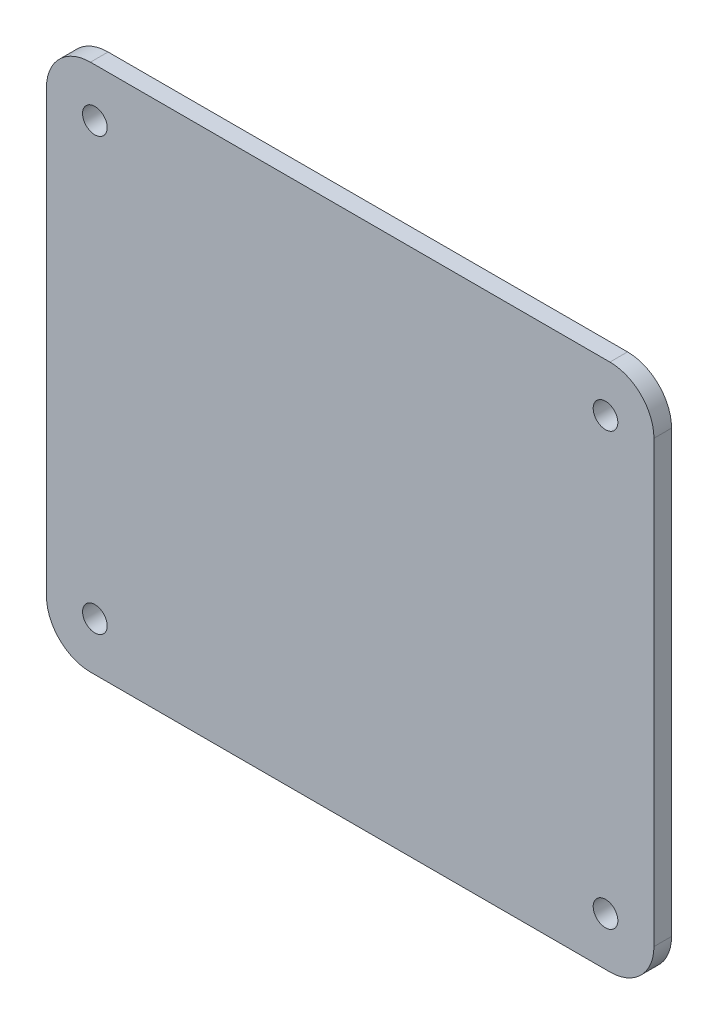
ISO-10303-21;
HEADER;
FILE_DESCRIPTION(('STEP AP214'),'2;1');
FILE_NAME('part.step','',(''),(''),'','','');
FILE_SCHEMA(('AUTOMOTIVE_DESIGN { 1 0 10303 214 1 1 1 1 }'));
ENDSEC;
DATA;
#1=APPLICATION_CONTEXT('core data for automotive mechanical design processes');
#2=APPLICATION_PROTOCOL_DEFINITION('international standard','automotive_design',2000,#1);
#3=PRODUCT_CONTEXT('',#1,'mechanical');
#4=PRODUCT('Part','Part','',(#3));
#5=PRODUCT_RELATED_PRODUCT_CATEGORY('part','',(#4));
#6=PRODUCT_DEFINITION_FORMATION('','',#4);
#7=PRODUCT_DEFINITION_CONTEXT('part definition',#1,'design');
#8=PRODUCT_DEFINITION('design','',#6,#7);
#9=PRODUCT_DEFINITION_SHAPE('','',#8);
#10=(LENGTH_UNIT() NAMED_UNIT(*) SI_UNIT(.MILLI.,.METRE.));
#11=(NAMED_UNIT(*) PLANE_ANGLE_UNIT() SI_UNIT($,.RADIAN.));
#12=(NAMED_UNIT(*) SI_UNIT($,.STERADIAN.) SOLID_ANGLE_UNIT());
#13=UNCERTAINTY_MEASURE_WITH_UNIT(LENGTH_MEASURE(1.E-05),#10,'distance_accuracy_value','');
#14=(GEOMETRIC_REPRESENTATION_CONTEXT(3) GLOBAL_UNCERTAINTY_ASSIGNED_CONTEXT((#13)) GLOBAL_UNIT_ASSIGNED_CONTEXT((#10,
#11,#12)) REPRESENTATION_CONTEXT('',''));
#15=CARTESIAN_POINT('',(0.,0.,0.));
#16=DIRECTION('',(0.,0.,1.));
#17=DIRECTION('',(1.,0.,0.));
#18=AXIS2_PLACEMENT_3D('',#15,#16,#17);
#19=CARTESIAN_POINT('',(-18.2728243166483,9.35780803146775,53.7908655605488));
#20=DIRECTION('',(0.,0.,1.));
#21=DIRECTION('',(1.,0.,0.));
#22=AXIS2_PLACEMENT_3D('',#19,#20,#21);
#23=PLANE('',#22);
#24=DIRECTION('',(0.,-1.,0.));
#25=VECTOR('',#24,1.);
#26=CARTESIAN_POINT('',(-8.27282431664827,54.3578080314676,53.7908655605488));
#27=LINE('',#26,#25);
#28=CARTESIAN_POINT('',(-8.27282431664827,54.3578080314676,53.7908655605488));
#29=VERTEX_POINT('',#28);
#30=CARTESIAN_POINT('',(-8.27282431664827,49.3578080314676,53.7908655605488));
#31=VERTEX_POINT('',#30);
#32=EDGE_CURVE('E275',#29,#31,#27,.T.);
#33=ORIENTED_EDGE('',*,*,#32,.F.);
#34=DIRECTION('',(1.,0.,0.));
#35=VECTOR('',#34,1.);
#36=CARTESIAN_POINT('',(-8.27282431664827,54.3578080314676,53.7908655605488));
#37=LINE('',#36,#35);
#38=CARTESIAN_POINT('',(-13.2728243166483,54.3578080314676,53.7908655605488));
#39=VERTEX_POINT('',#38);
#40=EDGE_CURVE('E280',#39,#29,#37,.T.);
#41=ORIENTED_EDGE('',*,*,#40,.F.);
#42=DIRECTION('',(0.,1.,0.));
#43=VECTOR('',#42,1.);
#44=CARTESIAN_POINT('',(-13.2728243166483,54.3578080314676,53.7908655605488));
#45=LINE('',#44,#43);
#46=CARTESIAN_POINT('',(-13.2728243166483,49.3578080314676,53.7908655605488));
#47=VERTEX_POINT('',#46);
#48=EDGE_CURVE('E292',#47,#39,#45,.T.);
#49=ORIENTED_EDGE('',*,*,#48,.F.);
#50=DIRECTION('',(-1.,0.,0.));
#51=VECTOR('',#50,1.);
#52=CARTESIAN_POINT('',(-8.27282431664827,49.3578080314676,53.7908655605488));
#53=LINE('',#52,#51);
#54=EDGE_CURVE('E289',#31,#47,#53,.T.);
#55=ORIENTED_EDGE('',*,*,#54,.F.);
#56=EDGE_LOOP('',(#33,#41,#49,#55));
#57=FACE_BOUND('',#56,.T.);
#58=DIRECTION('',(0.,-1.,0.));
#59=VECTOR('',#58,1.);
#60=CARTESIAN_POINT('',(35.7271756833516,54.3578080314676,53.7908655605488));
#61=LINE('',#60,#59);
#62=CARTESIAN_POINT('',(35.7271756833516,54.3578080314676,53.7908655605488));
#63=VERTEX_POINT('',#62);
#64=CARTESIAN_POINT('',(35.7271756833516,49.3578080314676,53.7908655605488));
#65=VERTEX_POINT('',#64);
#66=EDGE_CURVE('E341',#63,#65,#61,.T.);
#67=ORIENTED_EDGE('',*,*,#66,.F.);
#68=DIRECTION('',(1.,0.,0.));
#69=VECTOR('',#68,1.);
#70=CARTESIAN_POINT('',(35.7271756833516,54.3578080314676,53.7908655605488));
#71=LINE('',#70,#69);
#72=CARTESIAN_POINT('',(30.7271756833516,54.3578080314676,53.7908655605488));
#73=VERTEX_POINT('',#72);
#74=EDGE_CURVE('E346',#73,#63,#71,.T.);
#75=ORIENTED_EDGE('',*,*,#74,.F.);
#76=DIRECTION('',(0.,1.,0.));
#77=VECTOR('',#76,1.);
#78=CARTESIAN_POINT('',(30.7271756833516,54.3578080314676,53.7908655605488));
#79=LINE('',#78,#77);
#80=CARTESIAN_POINT('',(30.7271756833516,49.3578080314676,53.7908655605488));
#81=VERTEX_POINT('',#80);
#82=EDGE_CURVE('E358',#81,#73,#79,.T.);
#83=ORIENTED_EDGE('',*,*,#82,.F.);
#84=DIRECTION('',(-1.,0.,0.));
#85=VECTOR('',#84,1.);
#86=CARTESIAN_POINT('',(35.7271756833516,49.3578080314676,53.7908655605488));
#87=LINE('',#86,#85);
#88=EDGE_CURVE('E355',#65,#81,#87,.T.);
#89=ORIENTED_EDGE('',*,*,#88,.F.);
#90=EDGE_LOOP('',(#67,#75,#83,#89));
#91=FACE_BOUND('',#90,.T.);
#92=CARTESIAN_POINT('',(40.2271756833516,58.8578080314677,53.7908655605488));
#93=DIRECTION('',(0.,0.,1.));
#94=DIRECTION('',(-1.,0.,0.));
#95=AXIS2_PLACEMENT_3D('',#92,#93,#94);
#96=CIRCLE('',#95,1.39999999999984);
#97=CARTESIAN_POINT('',(38.8271756833518,58.8578080314677,53.7908655605488));
#98=VERTEX_POINT('',#97);
#99=EDGE_CURVE('E374',#98,#98,#96,.T.);
#100=ORIENTED_EDGE('',*,*,#99,.T.);
#101=EDGE_LOOP('',(#100));
#102=FACE_BOUND('',#101,.T.);
#103=CARTESIAN_POINT('',(-17.7728243166482,58.8578080314677,53.7908655605488));
#104=DIRECTION('',(0.,0.,1.));
#105=DIRECTION('',(1.,0.,0.));
#106=AXIS2_PLACEMENT_3D('',#103,#104,#105);
#107=CIRCLE('',#106,1.39999999999984);
#108=CARTESIAN_POINT('',(-16.3728243166483,58.8578080314677,53.7908655605488));
#109=VERTEX_POINT('',#108);
#110=EDGE_CURVE('E379',#109,#109,#107,.T.);
#111=ORIENTED_EDGE('',*,*,#110,.T.);
#112=EDGE_LOOP('',(#111));
#113=FACE_BOUND('',#112,.T.);
#114=CARTESIAN_POINT('',(-17.7728243166482,9.85780803146746,53.7908655605488));
#115=DIRECTION('',(0.,0.,1.));
#116=DIRECTION('',(-1.,0.,0.));
#117=AXIS2_PLACEMENT_3D('',#114,#115,#116);
#118=CIRCLE('',#117,1.39999999999984);
#119=CARTESIAN_POINT('',(-19.172824316648,9.85780803146746,53.7908655605488));
#120=VERTEX_POINT('',#119);
#121=EDGE_CURVE('E375',#120,#120,#118,.T.);
#122=ORIENTED_EDGE('',*,*,#121,.T.);
#123=EDGE_LOOP('',(#122));
#124=FACE_BOUND('',#123,.T.);
#125=CARTESIAN_POINT('',(40.2271756833516,9.85780803146746,53.7908655605488));
#126=DIRECTION('',(0.,0.,1.));
#127=DIRECTION('',(1.,0.,0.));
#128=AXIS2_PLACEMENT_3D('',#125,#126,#127);
#129=CIRCLE('',#128,1.39999999999984);
#130=CARTESIAN_POINT('',(41.6271756833515,9.85780803146746,53.7908655605488));
#131=VERTEX_POINT('',#130);
#132=EDGE_CURVE('E378',#131,#131,#129,.T.);
#133=ORIENTED_EDGE('',*,*,#132,.T.);
#134=EDGE_LOOP('',(#133));
#135=FACE_BOUND('',#134,.T.);
#136=CARTESIAN_POINT('',(-18.2728243166483,9.35780803146775,53.7908655605488));
#137=DIRECTION('',(0.,0.,1.));
#138=DIRECTION('',(1.,0.,0.));
#139=AXIS2_PLACEMENT_3D('',#136,#137,#138);
#140=CIRCLE('',#139,5.);
#141=CARTESIAN_POINT('',(-23.2728243166483,9.35780803146777,53.7908655605488));
#142=VERTEX_POINT('',#141);
#143=CARTESIAN_POINT('',(-18.2728243166483,4.35780803146775,53.7908655605488));
#144=VERTEX_POINT('',#143);
#145=EDGE_CURVE('E386',#142,#144,#140,.T.);
#146=ORIENTED_EDGE('',*,*,#145,.F.);
#147=DIRECTION('',(0.,-1.,0.));
#148=VECTOR('',#147,1.);
#149=CARTESIAN_POINT('',(-23.2728243166483,59.3578080314677,53.7908655605488));
#150=LINE('',#149,#148);
#151=CARTESIAN_POINT('',(-23.2728243166483,59.3578080314677,53.7908655605488));
#152=VERTEX_POINT('',#151);
#153=EDGE_CURVE('E206',#152,#142,#150,.T.);
#154=ORIENTED_EDGE('',*,*,#153,.F.);
#155=CARTESIAN_POINT('',(-18.2728243166483,59.3578080314678,53.7908655605488));
#156=DIRECTION('',(0.,0.,1.));
#157=DIRECTION('',(1.,0.,0.));
#158=AXIS2_PLACEMENT_3D('',#155,#156,#157);
#159=CIRCLE('',#158,4.99999999999999);
#160=CARTESIAN_POINT('',(-18.2728243166483,64.3578080314677,53.7908655605488));
#161=VERTEX_POINT('',#160);
#162=EDGE_CURVE('E402',#161,#152,#159,.T.);
#163=ORIENTED_EDGE('',*,*,#162,.F.);
#164=DIRECTION('',(-1.,0.,0.));
#165=VECTOR('',#164,1.);
#166=CARTESIAN_POINT('',(40.7271756833517,64.3578080314676,53.7908655605488));
#167=LINE('',#166,#165);
#168=CARTESIAN_POINT('',(40.7271756833517,64.3578080314676,53.7908655605488));
#169=VERTEX_POINT('',#168);
#170=EDGE_CURVE('E201',#169,#161,#167,.T.);
#171=ORIENTED_EDGE('',*,*,#170,.F.);
#172=CARTESIAN_POINT('',(40.7271756833517,59.3578080314676,53.7908655605488));
#173=DIRECTION('',(0.,0.,1.));
#174=DIRECTION('',(1.,0.,0.));
#175=AXIS2_PLACEMENT_3D('',#172,#173,#174);
#176=CIRCLE('',#175,5.00000000000002);
#177=CARTESIAN_POINT('',(45.7271756833517,59.3578080314676,53.7908655605488));
#178=VERTEX_POINT('',#177);
#179=EDGE_CURVE('E398',#178,#169,#176,.T.);
#180=ORIENTED_EDGE('',*,*,#179,.F.);
#181=DIRECTION('',(0.,1.,0.));
#182=VECTOR('',#181,1.);
#183=CARTESIAN_POINT('',(45.7271756833516,9.35780803146761,53.7908655605488));
#184=LINE('',#183,#182);
#185=CARTESIAN_POINT('',(45.7271756833516,9.35780803146761,53.7908655605488));
#186=VERTEX_POINT('',#185);
#187=EDGE_CURVE('E395',#186,#178,#184,.T.);
#188=ORIENTED_EDGE('',*,*,#187,.F.);
#189=CARTESIAN_POINT('',(40.7271756833517,9.35780803146761,53.7908655605488));
#190=DIRECTION('',(0.,0.,1.));
#191=DIRECTION('',(1.,0.,0.));
#192=AXIS2_PLACEMENT_3D('',#189,#190,#191);
#193=CIRCLE('',#192,4.99999999999987);
#194=CARTESIAN_POINT('',(40.7271756833517,4.35780803146774,53.7908655605488));
#195=VERTEX_POINT('',#194);
#196=EDGE_CURVE('E392',#195,#186,#193,.T.);
#197=ORIENTED_EDGE('',*,*,#196,.F.);
#198=DIRECTION('',(1.,0.,0.));
#199=VECTOR('',#198,1.);
#200=CARTESIAN_POINT('',(-18.2728243166483,4.35780803146775,53.7908655605488));
#201=LINE('',#200,#199);
#202=EDGE_CURVE('E389',#144,#195,#201,.T.);
#203=ORIENTED_EDGE('',*,*,#202,.F.);
#204=EDGE_LOOP('',(#146,#154,#163,#171,#180,#188,#197,#203));
#205=FACE_BOUND('',#204,.T.);
#206=DIRECTION('',(0.,-1.,0.));
#207=VECTOR('',#206,1.);
#208=CARTESIAN_POINT('',(-8.27282431664828,19.3578080314677,53.7908655605488));
#209=LINE('',#208,#207);
#210=CARTESIAN_POINT('',(-8.27282431664828,19.3578080314677,53.7908655605488));
#211=VERTEX_POINT('',#210);
#212=CARTESIAN_POINT('',(-8.27282431664828,14.3578080314677,53.7908655605488));
#213=VERTEX_POINT('',#212);
#214=EDGE_CURVE('E308',#211,#213,#209,.T.);
#215=ORIENTED_EDGE('',*,*,#214,.F.);
#216=DIRECTION('',(1.,0.,0.));
#217=VECTOR('',#216,1.);
#218=CARTESIAN_POINT('',(-8.27282431664828,19.3578080314677,53.7908655605488));
#219=LINE('',#218,#217);
#220=CARTESIAN_POINT('',(-13.2728243166483,19.3578080314677,53.7908655605488));
#221=VERTEX_POINT('',#220);
#222=EDGE_CURVE('E313',#221,#211,#219,.T.);
#223=ORIENTED_EDGE('',*,*,#222,.F.);
#224=DIRECTION('',(0.,1.,0.));
#225=VECTOR('',#224,1.);
#226=CARTESIAN_POINT('',(-13.2728243166483,19.3578080314677,53.7908655605488));
#227=LINE('',#226,#225);
#228=CARTESIAN_POINT('',(-13.2728243166483,14.3578080314677,53.7908655605488));
#229=VERTEX_POINT('',#228);
#230=EDGE_CURVE('E325',#229,#221,#227,.T.);
#231=ORIENTED_EDGE('',*,*,#230,.F.);
#232=DIRECTION('',(-1.,0.,0.));
#233=VECTOR('',#232,1.);
#234=CARTESIAN_POINT('',(-8.27282431664828,14.3578080314677,53.7908655605488));
#235=LINE('',#234,#233);
#236=EDGE_CURVE('E322',#213,#229,#235,.T.);
#237=ORIENTED_EDGE('',*,*,#236,.F.);
#238=EDGE_LOOP('',(#215,#223,#231,#237));
#239=FACE_BOUND('',#238,.T.);
#240=DIRECTION('',(0.,-1.,0.));
#241=VECTOR('',#240,1.);
#242=CARTESIAN_POINT('',(35.7271756833516,19.3578080314677,53.7908655605488));
#243=LINE('',#242,#241);
#244=CARTESIAN_POINT('',(35.7271756833516,19.3578080314677,53.7908655605488));
#245=VERTEX_POINT('',#244);
#246=CARTESIAN_POINT('',(35.7271756833516,14.3578080314677,53.7908655605488));
#247=VERTEX_POINT('',#246);
#248=EDGE_CURVE('E247',#245,#247,#243,.T.);
#249=ORIENTED_EDGE('',*,*,#248,.F.);
#250=DIRECTION('',(1.,0.,0.));
#251=VECTOR('',#250,1.);
#252=CARTESIAN_POINT('',(35.7271756833516,19.3578080314677,53.7908655605488));
#253=LINE('',#252,#251);
#254=CARTESIAN_POINT('',(30.7271756833516,19.3578080314677,53.7908655605488));
#255=VERTEX_POINT('',#254);
#256=EDGE_CURVE('E252',#255,#245,#253,.T.);
#257=ORIENTED_EDGE('',*,*,#256,.F.);
#258=DIRECTION('',(0.,1.,0.));
#259=VECTOR('',#258,1.);
#260=CARTESIAN_POINT('',(30.7271756833516,19.3578080314677,53.7908655605488));
#261=LINE('',#260,#259);
#262=CARTESIAN_POINT('',(30.7271756833516,14.3578080314677,53.7908655605488));
#263=VERTEX_POINT('',#262);
#264=EDGE_CURVE('E57',#263,#255,#261,.T.);
#265=ORIENTED_EDGE('',*,*,#264,.F.);
#266=DIRECTION('',(-1.,0.,0.));
#267=VECTOR('',#266,1.);
#268=CARTESIAN_POINT('',(35.7271756833516,14.3578080314677,53.7908655605488));
#269=LINE('',#268,#267);
#270=EDGE_CURVE('E52',#247,#263,#269,.T.);
#271=ORIENTED_EDGE('',*,*,#270,.F.);
#272=EDGE_LOOP('',(#249,#257,#265,#271));
#273=FACE_BOUND('',#272,.T.);
#274=ADVANCED_FACE('F37',(#57,#91,#102,#113,#124,#135,#205,#239,#273),#23,.F.);
#275=CARTESIAN_POINT('',(-18.2728243166483,59.3578080314678,61.7908655605488));
#276=DIRECTION('',(0.,0.,-1.));
#277=DIRECTION('',(-1.,0.,0.));
#278=AXIS2_PLACEMENT_3D('',#275,#276,#277);
#279=CYLINDRICAL_SURFACE('',#278,4.99999999999999);
#280=DIRECTION('',(0.,0.,-1.));
#281=VECTOR('',#280,1.);
#282=CARTESIAN_POINT('',(-23.2728243166483,59.3578080314677,61.7908655605488));
#283=LINE('',#282,#281);
#284=CARTESIAN_POINT('',(-23.2728243166483,59.3578080314677,55.7908655605488));
#285=VERTEX_POINT('',#284);
#286=EDGE_CURVE('E11',#285,#152,#283,.T.);
#287=ORIENTED_EDGE('',*,*,#286,.F.);
#288=CARTESIAN_POINT('',(-18.2728243166483,59.3578080314678,55.7908655605488));
#289=DIRECTION('',(0.,0.,1.));
#290=DIRECTION('',(1.,0.,0.));
#291=AXIS2_PLACEMENT_3D('',#288,#289,#290);
#292=CIRCLE('',#291,4.99999999999999);
#293=CARTESIAN_POINT('',(-18.2728243166483,64.3578080314677,55.7908655605488));
#294=VERTEX_POINT('',#293);
#295=EDGE_CURVE('E209',#294,#285,#292,.T.);
#296=ORIENTED_EDGE('',*,*,#295,.F.);
#297=DIRECTION('',(0.,0.,-1.));
#298=VECTOR('',#297,1.);
#299=CARTESIAN_POINT('',(-18.2728243166483,64.3578080314677,61.7908655605488));
#300=LINE('',#299,#298);
#301=EDGE_CURVE('E195',#294,#161,#300,.T.);
#302=ORIENTED_EDGE('',*,*,#301,.T.);
#303=ORIENTED_EDGE('',*,*,#162,.T.);
#304=EDGE_LOOP('',(#287,#296,#302,#303));
#305=FACE_BOUND('',#304,.T.);
#306=ADVANCED_FACE('F39',(#305),#279,.T.);
#307=CARTESIAN_POINT('',(-23.2728243166483,59.3578080314677,61.7908655605488));
#308=DIRECTION('',(1.,0.,0.));
#309=DIRECTION('',(0.,1.,0.));
#310=AXIS2_PLACEMENT_3D('',#307,#308,#309);
#311=PLANE('',#310);
#312=DIRECTION('',(0.,0.,-1.));
#313=VECTOR('',#312,1.);
#314=CARTESIAN_POINT('',(-23.2728243166483,9.35780803146777,61.7908655605488));
#315=LINE('',#314,#313);
#316=CARTESIAN_POINT('',(-23.2728243166483,9.35780803146777,55.7908655605488));
#317=VERTEX_POINT('',#316);
#318=EDGE_CURVE('E45',#317,#142,#315,.T.);
#319=ORIENTED_EDGE('',*,*,#318,.F.);
#320=DIRECTION('',(0.,-1.,0.));
#321=VECTOR('',#320,1.);
#322=CARTESIAN_POINT('',(-23.2728243166483,0.,55.7908655605488));
#323=LINE('',#322,#321);
#324=EDGE_CURVE('E213',#285,#317,#323,.T.);
#325=ORIENTED_EDGE('',*,*,#324,.F.);
#326=ORIENTED_EDGE('',*,*,#286,.T.);
#327=ORIENTED_EDGE('',*,*,#153,.T.);
#328=EDGE_LOOP('',(#319,#325,#326,#327));
#329=FACE_BOUND('',#328,.T.);
#330=ADVANCED_FACE('F420',(#329),#311,.F.);
#331=CARTESIAN_POINT('',(-18.2728243166483,9.35780803146775,61.7908655605488));
#332=DIRECTION('',(0.,0.,-1.));
#333=DIRECTION('',(-1.,0.,0.));
#334=AXIS2_PLACEMENT_3D('',#331,#332,#333);
#335=CYLINDRICAL_SURFACE('',#334,5.);
#336=DIRECTION('',(0.,0.,-1.));
#337=VECTOR('',#336,1.);
#338=CARTESIAN_POINT('',(-18.2728243166483,4.35780803146775,61.7908655605488));
#339=LINE('',#338,#337);
#340=CARTESIAN_POINT('',(-18.2728243166483,4.35780803146775,55.7908655605488));
#341=VERTEX_POINT('',#340);
#342=EDGE_CURVE('E413',#341,#144,#339,.T.);
#343=ORIENTED_EDGE('',*,*,#342,.F.);
#344=CARTESIAN_POINT('',(-18.2728243166483,9.35780803146775,55.7908655605488));
#345=DIRECTION('',(0.,0.,1.));
#346=DIRECTION('',(1.,0.,0.));
#347=AXIS2_PLACEMENT_3D('',#344,#345,#346);
#348=CIRCLE('',#347,5.);
#349=EDGE_CURVE('E229',#317,#341,#348,.T.);
#350=ORIENTED_EDGE('',*,*,#349,.F.);
#351=ORIENTED_EDGE('',*,*,#318,.T.);
#352=ORIENTED_EDGE('',*,*,#145,.T.);
#353=EDGE_LOOP('',(#343,#350,#351,#352));
#354=FACE_BOUND('',#353,.T.);
#355=ADVANCED_FACE('F416',(#354),#335,.T.);
#356=CARTESIAN_POINT('',(-18.2728243166483,4.35780803146775,61.7908655605488));
#357=DIRECTION('',(0.,1.,0.));
#358=DIRECTION('',(0.,0.,1.));
#359=AXIS2_PLACEMENT_3D('',#356,#357,#358);
#360=PLANE('',#359);
#361=DIRECTION('',(0.,0.,-1.));
#362=VECTOR('',#361,1.);
#363=CARTESIAN_POINT('',(40.7271756833517,4.35780803146775,61.7908655605488));
#364=LINE('',#363,#362);
#365=CARTESIAN_POINT('',(40.7271756833517,4.35780803146771,55.7908655605488));
#366=VERTEX_POINT('',#365);
#367=EDGE_CURVE('E411',#366,#195,#364,.T.);
#368=ORIENTED_EDGE('',*,*,#367,.F.);
#369=DIRECTION('',(1.,0.,0.));
#370=VECTOR('',#369,1.);
#371=CARTESIAN_POINT('',(0.,4.35780803146775,55.7908655605488));
#372=LINE('',#371,#370);
#373=EDGE_CURVE('E232',#341,#366,#372,.T.);
#374=ORIENTED_EDGE('',*,*,#373,.F.);
#375=ORIENTED_EDGE('',*,*,#342,.T.);
#376=ORIENTED_EDGE('',*,*,#202,.T.);
#377=EDGE_LOOP('',(#368,#374,#375,#376));
#378=FACE_BOUND('',#377,.T.);
#379=ADVANCED_FACE('F427',(#378),#360,.F.);
#380=CARTESIAN_POINT('',(40.7271756833517,9.35780803146761,61.7908655605488));
#381=DIRECTION('',(0.,0.,-1.));
#382=DIRECTION('',(-1.,0.,0.));
#383=AXIS2_PLACEMENT_3D('',#380,#381,#382);
#384=CYLINDRICAL_SURFACE('',#383,4.9999999999999);
#385=DIRECTION('',(0.,0.,-1.));
#386=VECTOR('',#385,1.);
#387=CARTESIAN_POINT('',(45.7271756833516,9.35780803146761,61.7908655605488));
#388=LINE('',#387,#386);
#389=CARTESIAN_POINT('',(45.7271756833517,9.35780803146761,55.7908655605488));
#390=VERTEX_POINT('',#389);
#391=EDGE_CURVE('E409',#390,#186,#388,.T.);
#392=ORIENTED_EDGE('',*,*,#391,.F.);
#393=CARTESIAN_POINT('',(40.7271756833517,9.35780803146761,55.7908655605488));
#394=DIRECTION('',(0.,0.,1.));
#395=DIRECTION('',(1.,0.,0.));
#396=AXIS2_PLACEMENT_3D('',#393,#394,#395);
#397=CIRCLE('',#396,4.9999999999999);
#398=EDGE_CURVE('E235',#366,#390,#397,.T.);
#399=ORIENTED_EDGE('',*,*,#398,.F.);
#400=ORIENTED_EDGE('',*,*,#367,.T.);
#401=ORIENTED_EDGE('',*,*,#196,.T.);
#402=EDGE_LOOP('',(#392,#399,#400,#401));
#403=FACE_BOUND('',#402,.T.);
#404=ADVANCED_FACE('F432',(#403),#384,.T.);
#405=CARTESIAN_POINT('',(45.7271756833517,9.35780803146765,61.7908655605488));
#406=DIRECTION('',(-1.,0.,0.));
#407=DIRECTION('',(0.,-1.,0.));
#408=AXIS2_PLACEMENT_3D('',#405,#406,#407);
#409=PLANE('',#408);
#410=DIRECTION('',(0.,0.,-1.));
#411=VECTOR('',#410,1.);
#412=CARTESIAN_POINT('',(45.7271756833517,59.3578080314676,61.7908655605488));
#413=LINE('',#412,#411);
#414=CARTESIAN_POINT('',(45.7271756833518,59.3578080314676,55.7908655605488));
#415=VERTEX_POINT('',#414);
#416=EDGE_CURVE('E407',#415,#178,#413,.T.);
#417=ORIENTED_EDGE('',*,*,#416,.F.);
#418=DIRECTION('',(0.,1.,0.));
#419=VECTOR('',#418,1.);
#420=CARTESIAN_POINT('',(45.7271756833516,0.,55.7908655605488));
#421=LINE('',#420,#419);
#422=EDGE_CURVE('E238',#390,#415,#421,.T.);
#423=ORIENTED_EDGE('',*,*,#422,.F.);
#424=ORIENTED_EDGE('',*,*,#391,.T.);
#425=ORIENTED_EDGE('',*,*,#187,.T.);
#426=EDGE_LOOP('',(#417,#423,#424,#425));
#427=FACE_BOUND('',#426,.T.);
#428=ADVANCED_FACE('F434',(#427),#409,.F.);
#429=CARTESIAN_POINT('',(40.7271756833517,59.3578080314676,61.7908655605488));
#430=DIRECTION('',(0.,0.,-1.));
#431=DIRECTION('',(-1.,0.,0.));
#432=AXIS2_PLACEMENT_3D('',#429,#430,#431);
#433=CYLINDRICAL_SURFACE('',#432,5.00000000000004);
#434=DIRECTION('',(0.,0.,-1.));
#435=VECTOR('',#434,1.);
#436=CARTESIAN_POINT('',(40.7271756833517,64.3578080314677,61.7908655605488));
#437=LINE('',#436,#435);
#438=CARTESIAN_POINT('',(40.7271756833517,64.3578080314677,55.7908655605488));
#439=VERTEX_POINT('',#438);
#440=EDGE_CURVE('E205',#439,#169,#437,.T.);
#441=ORIENTED_EDGE('',*,*,#440,.F.);
#442=CARTESIAN_POINT('',(40.7271756833517,59.3578080314676,55.7908655605488));
#443=DIRECTION('',(0.,0.,1.));
#444=DIRECTION('',(1.,0.,0.));
#445=AXIS2_PLACEMENT_3D('',#442,#443,#444);
#446=CIRCLE('',#445,5.00000000000004);
#447=EDGE_CURVE('E220',#415,#439,#446,.T.);
#448=ORIENTED_EDGE('',*,*,#447,.F.);
#449=ORIENTED_EDGE('',*,*,#416,.T.);
#450=ORIENTED_EDGE('',*,*,#179,.T.);
#451=EDGE_LOOP('',(#441,#448,#449,#450));
#452=FACE_BOUND('',#451,.T.);
#453=ADVANCED_FACE('F437',(#452),#433,.T.);
#454=CARTESIAN_POINT('',(40.7271756833517,64.3578080314677,61.7908655605488));
#455=DIRECTION('',(0.,-1.,0.));
#456=DIRECTION('',(1.,0.,0.));
#457=AXIS2_PLACEMENT_3D('',#454,#455,#456);
#458=PLANE('',#457);
#459=ORIENTED_EDGE('',*,*,#301,.F.);
#460=DIRECTION('',(-1.,0.,0.));
#461=VECTOR('',#460,1.);
#462=CARTESIAN_POINT('',(0.,64.3578080314677,55.7908655605488));
#463=LINE('',#462,#461);
#464=EDGE_CURVE('E199',#439,#294,#463,.T.);
#465=ORIENTED_EDGE('',*,*,#464,.F.);
#466=ORIENTED_EDGE('',*,*,#440,.T.);
#467=ORIENTED_EDGE('',*,*,#170,.T.);
#468=EDGE_LOOP('',(#459,#465,#466,#467));
#469=FACE_BOUND('',#468,.T.);
#470=ADVANCED_FACE('F197',(#469),#458,.F.);
#471=CARTESIAN_POINT('',(-17.7728243166483,58.8578080314677,58.4908655605488));
#472=DIRECTION('',(0.,0.,-1.));
#473=DIRECTION('',(-1.,0.,0.));
#474=AXIS2_PLACEMENT_3D('',#471,#472,#473);
#475=CYLINDRICAL_SURFACE('',#474,1.39999999999999);
#476=ORIENTED_EDGE('',*,*,#110,.F.);
#477=EDGE_LOOP('',(#476));
#478=FACE_BOUND('',#477,.T.);
#479=CARTESIAN_POINT('',(-17.7728243166483,58.8578080314677,55.7908655605488));
#480=DIRECTION('',(0.,0.,1.));
#481=DIRECTION('',(1.,0.,0.));
#482=AXIS2_PLACEMENT_3D('',#479,#480,#481);
#483=CIRCLE('',#482,1.39999999999999);
#484=CARTESIAN_POINT('',(-16.3728243166483,58.8578080314677,55.7908655605488));
#485=VERTEX_POINT('',#484);
#486=EDGE_CURVE('E221',#485,#485,#483,.F.);
#487=ORIENTED_EDGE('',*,*,#486,.F.);
#488=EDGE_LOOP('',(#487));
#489=FACE_BOUND('',#488,.T.);
#490=ADVANCED_FACE('F444',(#478,#489),#475,.F.);
#491=CARTESIAN_POINT('',(40.2271756833518,58.8578080314677,58.4908655605488));
#492=DIRECTION('',(0.,0.,-1.));
#493=DIRECTION('',(-1.,0.,0.));
#494=AXIS2_PLACEMENT_3D('',#491,#492,#493);
#495=CYLINDRICAL_SURFACE('',#494,1.39999999999999);
#496=ORIENTED_EDGE('',*,*,#99,.F.);
#497=EDGE_LOOP('',(#496));
#498=FACE_BOUND('',#497,.T.);
#499=CARTESIAN_POINT('',(40.2271756833518,58.8578080314677,55.7908655605488));
#500=DIRECTION('',(0.,0.,1.));
#501=DIRECTION('',(1.,0.,0.));
#502=AXIS2_PLACEMENT_3D('',#499,#500,#501);
#503=CIRCLE('',#502,1.39999999999999);
#504=CARTESIAN_POINT('',(41.6271756833517,58.8578080314677,55.7908655605488));
#505=VERTEX_POINT('',#504);
#506=EDGE_CURVE('E241',#505,#505,#503,.F.);
#507=ORIENTED_EDGE('',*,*,#506,.F.);
#508=EDGE_LOOP('',(#507));
#509=FACE_BOUND('',#508,.T.);
#510=ADVANCED_FACE('F457',(#498,#509),#495,.F.);
#511=CARTESIAN_POINT('',(-17.7728243166484,9.85780803146775,58.4908655605488));
#512=DIRECTION('',(0.,0.,-1.));
#513=DIRECTION('',(-1.,0.,0.));
#514=AXIS2_PLACEMENT_3D('',#511,#512,#513);
#515=CYLINDRICAL_SURFACE('',#514,1.4);
#516=ORIENTED_EDGE('',*,*,#121,.F.);
#517=EDGE_LOOP('',(#516));
#518=FACE_BOUND('',#517,.T.);
#519=CARTESIAN_POINT('',(-17.7728243166484,9.85780803146775,55.7908655605488));
#520=DIRECTION('',(0.,0.,1.));
#521=DIRECTION('',(1.,0.,0.));
#522=AXIS2_PLACEMENT_3D('',#519,#520,#521);
#523=CIRCLE('',#522,1.4);
#524=CARTESIAN_POINT('',(-16.3728243166484,9.85780803146775,55.7908655605488));
#525=VERTEX_POINT('',#524);
#526=EDGE_CURVE('E224',#525,#525,#523,.F.);
#527=ORIENTED_EDGE('',*,*,#526,.F.);
#528=EDGE_LOOP('',(#527));
#529=FACE_BOUND('',#528,.T.);
#530=ADVANCED_FACE('F461',(#518,#529),#515,.F.);
#531=CARTESIAN_POINT('',(40.2271756833516,9.85780803146746,58.4908655605488));
#532=DIRECTION('',(0.,0.,-1.));
#533=DIRECTION('',(-1.,0.,0.));
#534=AXIS2_PLACEMENT_3D('',#531,#532,#533);
#535=CYLINDRICAL_SURFACE('',#534,1.39999999999985);
#536=ORIENTED_EDGE('',*,*,#132,.F.);
#537=EDGE_LOOP('',(#536));
#538=FACE_BOUND('',#537,.T.);
#539=CARTESIAN_POINT('',(40.2271756833516,9.85780803146746,55.7908655605488));
#540=DIRECTION('',(0.,0.,1.));
#541=DIRECTION('',(1.,0.,0.));
#542=AXIS2_PLACEMENT_3D('',#539,#540,#541);
#543=CIRCLE('',#542,1.39999999999985);
#544=CARTESIAN_POINT('',(41.6271756833515,9.85780803146746,55.7908655605488));
#545=VERTEX_POINT('',#544);
#546=EDGE_CURVE('E244',#545,#545,#543,.F.);
#547=ORIENTED_EDGE('',*,*,#546,.F.);
#548=EDGE_LOOP('',(#547));
#549=FACE_BOUND('',#548,.T.);
#550=ADVANCED_FACE('F465',(#538,#549),#535,.F.);
#551=CARTESIAN_POINT('',(35.7271756833516,54.3578080314676,46.7908655605488));
#552=DIRECTION('',(-1.,0.,0.));
#553=DIRECTION('',(0.,0.,1.));
#554=AXIS2_PLACEMENT_3D('',#551,#552,#553);
#555=PLANE('',#554);
#556=ORIENTED_EDGE('',*,*,#66,.T.);
#557=DIRECTION('',(0.,0.,1.));
#558=VECTOR('',#557,1.);
#559=CARTESIAN_POINT('',(35.7271756833516,49.3578080314676,46.7908655605488));
#560=LINE('',#559,#558);
#561=CARTESIAN_POINT('',(35.7271756833516,49.3578080314676,46.7908655605488));
#562=VERTEX_POINT('',#561);
#563=EDGE_CURVE('E371',#562,#65,#560,.T.);
#564=ORIENTED_EDGE('',*,*,#563,.F.);
#565=DIRECTION('',(0.,-1.,0.));
#566=VECTOR('',#565,1.);
#567=CARTESIAN_POINT('',(35.7271756833516,54.3578080314676,46.7908655605488));
#568=LINE('',#567,#566);
#569=CARTESIAN_POINT('',(35.7271756833516,54.3578080314676,46.7908655605488));
#570=VERTEX_POINT('',#569);
#571=EDGE_CURVE('E342',#570,#562,#568,.T.);
#572=ORIENTED_EDGE('',*,*,#571,.F.);
#573=DIRECTION('',(0.,0.,1.));
#574=VECTOR('',#573,1.);
#575=CARTESIAN_POINT('',(35.7271756833516,54.3578080314676,46.7908655605488));
#576=LINE('',#575,#574);
#577=EDGE_CURVE('E352',#570,#63,#576,.T.);
#578=ORIENTED_EDGE('',*,*,#577,.T.);
#579=EDGE_LOOP('',(#556,#564,#572,#578));
#580=FACE_BOUND('',#579,.T.);
#581=ADVANCED_FACE('F469',(#580),#555,.F.);
#582=CARTESIAN_POINT('',(35.7271756833516,49.3578080314676,46.7908655605488));
#583=DIRECTION('',(0.,1.,0.));
#584=DIRECTION('',(-1.,0.,0.));
#585=AXIS2_PLACEMENT_3D('',#582,#583,#584);
#586=PLANE('',#585);
#587=ORIENTED_EDGE('',*,*,#88,.T.);
#588=DIRECTION('',(0.,0.,1.));
#589=VECTOR('',#588,1.);
#590=CARTESIAN_POINT('',(30.7271756833516,49.3578080314676,46.7908655605488));
#591=LINE('',#590,#589);
#592=CARTESIAN_POINT('',(30.7271756833516,49.3578080314676,46.7908655605488));
#593=VERTEX_POINT('',#592);
#594=EDGE_CURVE('E368',#593,#81,#591,.T.);
#595=ORIENTED_EDGE('',*,*,#594,.F.);
#596=DIRECTION('',(-1.,0.,0.));
#597=VECTOR('',#596,1.);
#598=CARTESIAN_POINT('',(35.7271756833516,49.3578080314676,46.7908655605488));
#599=LINE('',#598,#597);
#600=EDGE_CURVE('E345',#562,#593,#599,.T.);
#601=ORIENTED_EDGE('',*,*,#600,.F.);
#602=ORIENTED_EDGE('',*,*,#563,.T.);
#603=EDGE_LOOP('',(#587,#595,#601,#602));
#604=FACE_BOUND('',#603,.T.);
#605=ADVANCED_FACE('F473',(#604),#586,.F.);
#606=CARTESIAN_POINT('',(30.7271756833516,54.3578080314676,46.7908655605488));
#607=DIRECTION('',(1.,0.,0.));
#608=DIRECTION('',(0.,1.,0.));
#609=AXIS2_PLACEMENT_3D('',#606,#607,#608);
#610=PLANE('',#609);
#611=ORIENTED_EDGE('',*,*,#82,.T.);
#612=DIRECTION('',(0.,0.,1.));
#613=VECTOR('',#612,1.);
#614=CARTESIAN_POINT('',(30.7271756833516,54.3578080314676,46.7908655605488));
#615=LINE('',#614,#613);
#616=CARTESIAN_POINT('',(30.7271756833516,54.3578080314676,46.7908655605488));
#617=VERTEX_POINT('',#616);
#618=EDGE_CURVE('E365',#617,#73,#615,.T.);
#619=ORIENTED_EDGE('',*,*,#618,.F.);
#620=DIRECTION('',(0.,1.,0.));
#621=VECTOR('',#620,1.);
#622=CARTESIAN_POINT('',(30.7271756833516,54.3578080314676,46.7908655605488));
#623=LINE('',#622,#621);
#624=EDGE_CURVE('E348',#593,#617,#623,.T.);
#625=ORIENTED_EDGE('',*,*,#624,.F.);
#626=ORIENTED_EDGE('',*,*,#594,.T.);
#627=EDGE_LOOP('',(#611,#619,#625,#626));
#628=FACE_BOUND('',#627,.T.);
#629=ADVANCED_FACE('F477',(#628),#610,.F.);
#630=CARTESIAN_POINT('',(35.7271756833516,54.3578080314676,46.7908655605488));
#631=DIRECTION('',(0.,-1.,0.));
#632=DIRECTION('',(0.,0.,-1.));
#633=AXIS2_PLACEMENT_3D('',#630,#631,#632);
#634=PLANE('',#633);
#635=ORIENTED_EDGE('',*,*,#74,.T.);
#636=ORIENTED_EDGE('',*,*,#577,.F.);
#637=DIRECTION('',(1.,0.,0.));
#638=VECTOR('',#637,1.);
#639=CARTESIAN_POINT('',(35.7271756833516,54.3578080314676,46.7908655605488));
#640=LINE('',#639,#638);
#641=EDGE_CURVE('E350',#617,#570,#640,.T.);
#642=ORIENTED_EDGE('',*,*,#641,.F.);
#643=ORIENTED_EDGE('',*,*,#618,.T.);
#644=EDGE_LOOP('',(#635,#636,#642,#643));
#645=FACE_BOUND('',#644,.T.);
#646=ADVANCED_FACE('F481',(#645),#634,.F.);
#647=CARTESIAN_POINT('',(0.,0.,46.7908655605488));
#648=DIRECTION('',(0.,0.,-1.));
#649=DIRECTION('',(-1.,0.,0.));
#650=AXIS2_PLACEMENT_3D('',#647,#648,#649);
#651=PLANE('',#650);
#652=ORIENTED_EDGE('',*,*,#571,.T.);
#653=ORIENTED_EDGE('',*,*,#600,.T.);
#654=ORIENTED_EDGE('',*,*,#624,.T.);
#655=ORIENTED_EDGE('',*,*,#641,.T.);
#656=EDGE_LOOP('',(#652,#653,#654,#655));
#657=FACE_BOUND('',#656,.T.);
#658=ADVANCED_FACE('F485',(#657),#651,.T.);
#659=CARTESIAN_POINT('',(-8.27282431664828,19.3578080314677,46.7908655605488));
#660=DIRECTION('',(-1.,0.,0.));
#661=DIRECTION('',(0.,-1.,0.));
#662=AXIS2_PLACEMENT_3D('',#659,#660,#661);
#663=PLANE('',#662);
#664=ORIENTED_EDGE('',*,*,#214,.T.);
#665=DIRECTION('',(0.,0.,1.));
#666=VECTOR('',#665,1.);
#667=CARTESIAN_POINT('',(-8.27282431664828,14.3578080314677,46.7908655605488));
#668=LINE('',#667,#666);
#669=CARTESIAN_POINT('',(-8.27282431664828,14.3578080314677,46.7908655605488));
#670=VERTEX_POINT('',#669);
#671=EDGE_CURVE('E338',#670,#213,#668,.T.);
#672=ORIENTED_EDGE('',*,*,#671,.F.);
#673=DIRECTION('',(0.,-1.,0.));
#674=VECTOR('',#673,1.);
#675=CARTESIAN_POINT('',(-8.27282431664828,19.3578080314677,46.7908655605488));
#676=LINE('',#675,#674);
#677=CARTESIAN_POINT('',(-8.27282431664828,19.3578080314677,46.7908655605488));
#678=VERTEX_POINT('',#677);
#679=EDGE_CURVE('E309',#678,#670,#676,.T.);
#680=ORIENTED_EDGE('',*,*,#679,.F.);
#681=DIRECTION('',(0.,0.,1.));
#682=VECTOR('',#681,1.);
#683=CARTESIAN_POINT('',(-8.27282431664828,19.3578080314677,46.7908655605488));
#684=LINE('',#683,#682);
#685=EDGE_CURVE('E319',#678,#211,#684,.T.);
#686=ORIENTED_EDGE('',*,*,#685,.T.);
#687=EDGE_LOOP('',(#664,#672,#680,#686));
#688=FACE_BOUND('',#687,.T.);
#689=ADVANCED_FACE('F489',(#688),#663,.F.);
#690=CARTESIAN_POINT('',(-8.27282431664828,14.3578080314677,46.7908655605488));
#691=DIRECTION('',(0.,1.,0.));
#692=DIRECTION('',(0.,0.,1.));
#693=AXIS2_PLACEMENT_3D('',#690,#691,#692);
#694=PLANE('',#693);
#695=ORIENTED_EDGE('',*,*,#236,.T.);
#696=DIRECTION('',(0.,0.,1.));
#697=VECTOR('',#696,1.);
#698=CARTESIAN_POINT('',(-13.2728243166483,14.3578080314677,46.7908655605488));
#699=LINE('',#698,#697);
#700=CARTESIAN_POINT('',(-13.2728243166483,14.3578080314677,46.7908655605488));
#701=VERTEX_POINT('',#700);
#702=EDGE_CURVE('E335',#701,#229,#699,.T.);
#703=ORIENTED_EDGE('',*,*,#702,.F.);
#704=DIRECTION('',(-1.,0.,0.));
#705=VECTOR('',#704,1.);
#706=CARTESIAN_POINT('',(-8.27282431664828,14.3578080314677,46.7908655605488));
#707=LINE('',#706,#705);
#708=EDGE_CURVE('E312',#670,#701,#707,.T.);
#709=ORIENTED_EDGE('',*,*,#708,.F.);
#710=ORIENTED_EDGE('',*,*,#671,.T.);
#711=EDGE_LOOP('',(#695,#703,#709,#710));
#712=FACE_BOUND('',#711,.T.);
#713=ADVANCED_FACE('F493',(#712),#694,.F.);
#714=CARTESIAN_POINT('',(-13.2728243166483,19.3578080314677,46.7908655605488));
#715=DIRECTION('',(1.,0.,0.));
#716=DIRECTION('',(0.,0.,-1.));
#717=AXIS2_PLACEMENT_3D('',#714,#715,#716);
#718=PLANE('',#717);
#719=ORIENTED_EDGE('',*,*,#230,.T.);
#720=DIRECTION('',(0.,0.,1.));
#721=VECTOR('',#720,1.);
#722=CARTESIAN_POINT('',(-13.2728243166483,19.3578080314677,46.7908655605488));
#723=LINE('',#722,#721);
#724=CARTESIAN_POINT('',(-13.2728243166483,19.3578080314677,46.7908655605488));
#725=VERTEX_POINT('',#724);
#726=EDGE_CURVE('E332',#725,#221,#723,.T.);
#727=ORIENTED_EDGE('',*,*,#726,.F.);
#728=DIRECTION('',(0.,1.,0.));
#729=VECTOR('',#728,1.);
#730=CARTESIAN_POINT('',(-13.2728243166483,19.3578080314677,46.7908655605488));
#731=LINE('',#730,#729);
#732=EDGE_CURVE('E315',#701,#725,#731,.T.);
#733=ORIENTED_EDGE('',*,*,#732,.F.);
#734=ORIENTED_EDGE('',*,*,#702,.T.);
#735=EDGE_LOOP('',(#719,#727,#733,#734));
#736=FACE_BOUND('',#735,.T.);
#737=ADVANCED_FACE('F497',(#736),#718,.F.);
#738=CARTESIAN_POINT('',(-8.27282431664828,19.3578080314677,46.7908655605488));
#739=DIRECTION('',(0.,-1.,0.));
#740=DIRECTION('',(0.,0.,-1.));
#741=AXIS2_PLACEMENT_3D('',#738,#739,#740);
#742=PLANE('',#741);
#743=ORIENTED_EDGE('',*,*,#222,.T.);
#744=ORIENTED_EDGE('',*,*,#685,.F.);
#745=DIRECTION('',(1.,0.,0.));
#746=VECTOR('',#745,1.);
#747=CARTESIAN_POINT('',(-8.27282431664828,19.3578080314677,46.7908655605488));
#748=LINE('',#747,#746);
#749=EDGE_CURVE('E317',#725,#678,#748,.T.);
#750=ORIENTED_EDGE('',*,*,#749,.F.);
#751=ORIENTED_EDGE('',*,*,#726,.T.);
#752=EDGE_LOOP('',(#743,#744,#750,#751));
#753=FACE_BOUND('',#752,.T.);
#754=ADVANCED_FACE('F501',(#753),#742,.F.);
#755=CARTESIAN_POINT('',(0.,0.,46.7908655605488));
#756=DIRECTION('',(0.,0.,-1.));
#757=DIRECTION('',(-1.,0.,0.));
#758=AXIS2_PLACEMENT_3D('',#755,#756,#757);
#759=PLANE('',#758);
#760=ORIENTED_EDGE('',*,*,#679,.T.);
#761=ORIENTED_EDGE('',*,*,#708,.T.);
#762=ORIENTED_EDGE('',*,*,#732,.T.);
#763=ORIENTED_EDGE('',*,*,#749,.T.);
#764=EDGE_LOOP('',(#760,#761,#762,#763));
#765=FACE_BOUND('',#764,.T.);
#766=ADVANCED_FACE('F505',(#765),#759,.T.);
#767=CARTESIAN_POINT('',(-8.27282431664827,54.3578080314676,46.7908655605488));
#768=DIRECTION('',(-1.,0.,0.));
#769=DIRECTION('',(0.,-1.,0.));
#770=AXIS2_PLACEMENT_3D('',#767,#768,#769);
#771=PLANE('',#770);
#772=ORIENTED_EDGE('',*,*,#32,.T.);
#773=DIRECTION('',(0.,0.,1.));
#774=VECTOR('',#773,1.);
#775=CARTESIAN_POINT('',(-8.27282431664827,49.3578080314676,46.7908655605488));
#776=LINE('',#775,#774);
#777=CARTESIAN_POINT('',(-8.27282431664827,49.3578080314676,46.7908655605488));
#778=VERTEX_POINT('',#777);
#779=EDGE_CURVE('E305',#778,#31,#776,.T.);
#780=ORIENTED_EDGE('',*,*,#779,.F.);
#781=DIRECTION('',(0.,-1.,0.));
#782=VECTOR('',#781,1.);
#783=CARTESIAN_POINT('',(-8.27282431664827,54.3578080314676,46.7908655605488));
#784=LINE('',#783,#782);
#785=CARTESIAN_POINT('',(-8.27282431664827,54.3578080314676,46.7908655605488));
#786=VERTEX_POINT('',#785);
#787=EDGE_CURVE('E276',#786,#778,#784,.T.);
#788=ORIENTED_EDGE('',*,*,#787,.F.);
#789=DIRECTION('',(0.,0.,1.));
#790=VECTOR('',#789,1.);
#791=CARTESIAN_POINT('',(-8.27282431664827,54.3578080314676,46.7908655605488));
#792=LINE('',#791,#790);
#793=EDGE_CURVE('E286',#786,#29,#792,.T.);
#794=ORIENTED_EDGE('',*,*,#793,.T.);
#795=EDGE_LOOP('',(#772,#780,#788,#794));
#796=FACE_BOUND('',#795,.T.);
#797=ADVANCED_FACE('F509',(#796),#771,.F.);
#798=CARTESIAN_POINT('',(-8.27282431664827,49.3578080314676,46.7908655605488));
#799=DIRECTION('',(0.,1.,0.));
#800=DIRECTION('',(0.,0.,1.));
#801=AXIS2_PLACEMENT_3D('',#798,#799,#800);
#802=PLANE('',#801);
#803=ORIENTED_EDGE('',*,*,#54,.T.);
#804=DIRECTION('',(0.,0.,1.));
#805=VECTOR('',#804,1.);
#806=CARTESIAN_POINT('',(-13.2728243166483,49.3578080314676,46.7908655605488));
#807=LINE('',#806,#805);
#808=CARTESIAN_POINT('',(-13.2728243166483,49.3578080314676,46.7908655605488));
#809=VERTEX_POINT('',#808);
#810=EDGE_CURVE('E302',#809,#47,#807,.T.);
#811=ORIENTED_EDGE('',*,*,#810,.F.);
#812=DIRECTION('',(-1.,0.,0.));
#813=VECTOR('',#812,1.);
#814=CARTESIAN_POINT('',(-8.27282431664827,49.3578080314676,46.7908655605488));
#815=LINE('',#814,#813);
#816=EDGE_CURVE('E279',#778,#809,#815,.T.);
#817=ORIENTED_EDGE('',*,*,#816,.F.);
#818=ORIENTED_EDGE('',*,*,#779,.T.);
#819=EDGE_LOOP('',(#803,#811,#817,#818));
#820=FACE_BOUND('',#819,.T.);
#821=ADVANCED_FACE('F513',(#820),#802,.F.);
#822=CARTESIAN_POINT('',(-13.2728243166483,54.3578080314676,46.7908655605488));
#823=DIRECTION('',(1.,0.,0.));
#824=DIRECTION('',(0.,1.,0.));
#825=AXIS2_PLACEMENT_3D('',#822,#823,#824);
#826=PLANE('',#825);
#827=ORIENTED_EDGE('',*,*,#48,.T.);
#828=DIRECTION('',(0.,0.,1.));
#829=VECTOR('',#828,1.);
#830=CARTESIAN_POINT('',(-13.2728243166483,54.3578080314676,46.7908655605488));
#831=LINE('',#830,#829);
#832=CARTESIAN_POINT('',(-13.2728243166483,54.3578080314676,46.7908655605488));
#833=VERTEX_POINT('',#832);
#834=EDGE_CURVE('E299',#833,#39,#831,.T.);
#835=ORIENTED_EDGE('',*,*,#834,.F.);
#836=DIRECTION('',(0.,1.,0.));
#837=VECTOR('',#836,1.);
#838=CARTESIAN_POINT('',(-13.2728243166483,54.3578080314676,46.7908655605488));
#839=LINE('',#838,#837);
#840=EDGE_CURVE('E282',#809,#833,#839,.T.);
#841=ORIENTED_EDGE('',*,*,#840,.F.);
#842=ORIENTED_EDGE('',*,*,#810,.T.);
#843=EDGE_LOOP('',(#827,#835,#841,#842));
#844=FACE_BOUND('',#843,.T.);
#845=ADVANCED_FACE('F517',(#844),#826,.F.);
#846=CARTESIAN_POINT('',(-8.27282431664827,54.3578080314676,46.7908655605488));
#847=DIRECTION('',(0.,-1.,0.));
#848=DIRECTION('',(0.,0.,-1.));
#849=AXIS2_PLACEMENT_3D('',#846,#847,#848);
#850=PLANE('',#849);
#851=ORIENTED_EDGE('',*,*,#40,.T.);
#852=ORIENTED_EDGE('',*,*,#793,.F.);
#853=DIRECTION('',(1.,0.,0.));
#854=VECTOR('',#853,1.);
#855=CARTESIAN_POINT('',(-8.27282431664827,54.3578080314676,46.7908655605488));
#856=LINE('',#855,#854);
#857=EDGE_CURVE('E284',#833,#786,#856,.T.);
#858=ORIENTED_EDGE('',*,*,#857,.F.);
#859=ORIENTED_EDGE('',*,*,#834,.T.);
#860=EDGE_LOOP('',(#851,#852,#858,#859));
#861=FACE_BOUND('',#860,.T.);
#862=ADVANCED_FACE('F521',(#861),#850,.F.);
#863=CARTESIAN_POINT('',(0.,0.,46.7908655605488));
#864=DIRECTION('',(0.,0.,-1.));
#865=DIRECTION('',(-1.,0.,0.));
#866=AXIS2_PLACEMENT_3D('',#863,#864,#865);
#867=PLANE('',#866);
#868=ORIENTED_EDGE('',*,*,#787,.T.);
#869=ORIENTED_EDGE('',*,*,#816,.T.);
#870=ORIENTED_EDGE('',*,*,#840,.T.);
#871=ORIENTED_EDGE('',*,*,#857,.T.);
#872=EDGE_LOOP('',(#868,#869,#870,#871));
#873=FACE_BOUND('',#872,.T.);
#874=ADVANCED_FACE('F525',(#873),#867,.T.);
#875=CARTESIAN_POINT('',(35.7271756833516,19.3578080314677,46.7908655605488));
#876=DIRECTION('',(-1.,0.,0.));
#877=DIRECTION('',(0.,0.,1.));
#878=AXIS2_PLACEMENT_3D('',#875,#876,#877);
#879=PLANE('',#878);
#880=ORIENTED_EDGE('',*,*,#248,.T.);
#881=DIRECTION('',(0.,0.,1.));
#882=VECTOR('',#881,1.);
#883=CARTESIAN_POINT('',(35.7271756833516,14.3578080314677,46.7908655605488));
#884=LINE('',#883,#882);
#885=CARTESIAN_POINT('',(35.7271756833516,14.3578080314677,46.7908655605488));
#886=VERTEX_POINT('',#885);
#887=EDGE_CURVE('E273',#886,#247,#884,.T.);
#888=ORIENTED_EDGE('',*,*,#887,.F.);
#889=DIRECTION('',(0.,-1.,0.));
#890=VECTOR('',#889,1.);
#891=CARTESIAN_POINT('',(35.7271756833516,19.3578080314677,46.7908655605488));
#892=LINE('',#891,#890);
#893=CARTESIAN_POINT('',(35.7271756833516,19.3578080314677,46.7908655605488));
#894=VERTEX_POINT('',#893);
#895=EDGE_CURVE('E248',#894,#886,#892,.T.);
#896=ORIENTED_EDGE('',*,*,#895,.F.);
#897=DIRECTION('',(0.,0.,1.));
#898=VECTOR('',#897,1.);
#899=CARTESIAN_POINT('',(35.7271756833516,19.3578080314677,46.7908655605488));
#900=LINE('',#899,#898);
#901=EDGE_CURVE('E258',#894,#245,#900,.T.);
#902=ORIENTED_EDGE('',*,*,#901,.T.);
#903=EDGE_LOOP('',(#880,#888,#896,#902));
#904=FACE_BOUND('',#903,.T.);
#905=ADVANCED_FACE('F529',(#904),#879,.F.);
#906=CARTESIAN_POINT('',(35.7271756833516,14.3578080314677,46.7908655605488));
#907=DIRECTION('',(0.,1.,0.));
#908=DIRECTION('',(0.,0.,1.));
#909=AXIS2_PLACEMENT_3D('',#906,#907,#908);
#910=PLANE('',#909);
#911=ORIENTED_EDGE('',*,*,#270,.T.);
#912=DIRECTION('',(0.,0.,1.));
#913=VECTOR('',#912,1.);
#914=CARTESIAN_POINT('',(30.7271756833516,14.3578080314677,46.7908655605488));
#915=LINE('',#914,#913);
#916=CARTESIAN_POINT('',(30.7271756833516,14.3578080314677,46.7908655605488));
#917=VERTEX_POINT('',#916);
#918=EDGE_CURVE('E270',#917,#263,#915,.T.);
#919=ORIENTED_EDGE('',*,*,#918,.F.);
#920=DIRECTION('',(-1.,0.,0.));
#921=VECTOR('',#920,1.);
#922=CARTESIAN_POINT('',(35.7271756833516,14.3578080314677,46.7908655605488));
#923=LINE('',#922,#921);
#924=EDGE_CURVE('E251',#886,#917,#923,.T.);
#925=ORIENTED_EDGE('',*,*,#924,.F.);
#926=ORIENTED_EDGE('',*,*,#887,.T.);
#927=EDGE_LOOP('',(#911,#919,#925,#926));
#928=FACE_BOUND('',#927,.T.);
#929=ADVANCED_FACE('F533',(#928),#910,.F.);
#930=CARTESIAN_POINT('',(30.7271756833516,19.3578080314677,46.7908655605488));
#931=DIRECTION('',(1.,0.,0.));
#932=DIRECTION('',(0.,0.,-1.));
#933=AXIS2_PLACEMENT_3D('',#930,#931,#932);
#934=PLANE('',#933);
#935=ORIENTED_EDGE('',*,*,#264,.T.);
#936=DIRECTION('',(0.,0.,1.));
#937=VECTOR('',#936,1.);
#938=CARTESIAN_POINT('',(30.7271756833516,19.3578080314677,46.7908655605488));
#939=LINE('',#938,#937);
#940=CARTESIAN_POINT('',(30.7271756833516,19.3578080314677,46.7908655605488));
#941=VERTEX_POINT('',#940);
#942=EDGE_CURVE('E267',#941,#255,#939,.T.);
#943=ORIENTED_EDGE('',*,*,#942,.F.);
#944=DIRECTION('',(0.,1.,0.));
#945=VECTOR('',#944,1.);
#946=CARTESIAN_POINT('',(30.7271756833516,19.3578080314677,46.7908655605488));
#947=LINE('',#946,#945);
#948=EDGE_CURVE('E254',#917,#941,#947,.T.);
#949=ORIENTED_EDGE('',*,*,#948,.F.);
#950=ORIENTED_EDGE('',*,*,#918,.T.);
#951=EDGE_LOOP('',(#935,#943,#949,#950));
#952=FACE_BOUND('',#951,.T.);
#953=ADVANCED_FACE('F537',(#952),#934,.F.);
#954=CARTESIAN_POINT('',(35.7271756833516,19.3578080314677,46.7908655605488));
#955=DIRECTION('',(0.,-1.,0.));
#956=DIRECTION('',(0.,0.,-1.));
#957=AXIS2_PLACEMENT_3D('',#954,#955,#956);
#958=PLANE('',#957);
#959=ORIENTED_EDGE('',*,*,#256,.T.);
#960=ORIENTED_EDGE('',*,*,#901,.F.);
#961=DIRECTION('',(1.,0.,0.));
#962=VECTOR('',#961,1.);
#963=CARTESIAN_POINT('',(35.7271756833516,19.3578080314677,46.7908655605488));
#964=LINE('',#963,#962);
#965=EDGE_CURVE('E256',#941,#894,#964,.T.);
#966=ORIENTED_EDGE('',*,*,#965,.F.);
#967=ORIENTED_EDGE('',*,*,#942,.T.);
#968=EDGE_LOOP('',(#959,#960,#966,#967));
#969=FACE_BOUND('',#968,.T.);
#970=ADVANCED_FACE('F541',(#969),#958,.F.);
#971=CARTESIAN_POINT('',(0.,0.,46.7908655605488));
#972=DIRECTION('',(0.,0.,-1.));
#973=DIRECTION('',(-1.,0.,0.));
#974=AXIS2_PLACEMENT_3D('',#971,#972,#973);
#975=PLANE('',#974);
#976=ORIENTED_EDGE('',*,*,#895,.T.);
#977=ORIENTED_EDGE('',*,*,#924,.T.);
#978=ORIENTED_EDGE('',*,*,#948,.T.);
#979=ORIENTED_EDGE('',*,*,#965,.T.);
#980=EDGE_LOOP('',(#976,#977,#978,#979));
#981=FACE_BOUND('',#980,.T.);
#982=ADVANCED_FACE('F545',(#981),#975,.T.);
#983=CARTESIAN_POINT('',(0.,0.,55.7908655605488));
#984=DIRECTION('',(0.,0.,1.));
#985=DIRECTION('',(1.,0.,0.));
#986=AXIS2_PLACEMENT_3D('',#983,#984,#985);
#987=PLANE('',#986);
#988=ORIENTED_EDGE('',*,*,#526,.T.);
#989=EDGE_LOOP('',(#988));
#990=FACE_BOUND('',#989,.T.);
#991=ORIENTED_EDGE('',*,*,#486,.T.);
#992=EDGE_LOOP('',(#991));
#993=FACE_BOUND('',#992,.T.);
#994=ORIENTED_EDGE('',*,*,#464,.T.);
#995=ORIENTED_EDGE('',*,*,#295,.T.);
#996=ORIENTED_EDGE('',*,*,#324,.T.);
#997=ORIENTED_EDGE('',*,*,#349,.T.);
#998=ORIENTED_EDGE('',*,*,#373,.T.);
#999=ORIENTED_EDGE('',*,*,#398,.T.);
#1000=ORIENTED_EDGE('',*,*,#422,.T.);
#1001=ORIENTED_EDGE('',*,*,#447,.T.);
#1002=EDGE_LOOP('',(#994,#995,#996,#997,#998,#999,#1000,#1001));
#1003=FACE_BOUND('',#1002,.T.);
#1004=ORIENTED_EDGE('',*,*,#506,.T.);
#1005=EDGE_LOOP('',(#1004));
#1006=FACE_BOUND('',#1005,.T.);
#1007=ORIENTED_EDGE('',*,*,#546,.T.);
#1008=EDGE_LOOP('',(#1007));
#1009=FACE_BOUND('',#1008,.T.);
#1010=ADVANCED_FACE('F216',(#990,#993,#1003,#1006,#1009),#987,.T.);
#1011=CLOSED_SHELL('',(#274,#306,#330,#355,#379,#404,#428,#453,#470,#490,#510,#530,#550,#581,
#605,#629,#646,#658,#689,#713,#737,#754,#766,#797,#821,#845,#862,#874,#905,#929,#953,#970,#982,#1010));
#1012=MANIFOLD_SOLID_BREP('B2',#1011);
#1013=ADVANCED_BREP_SHAPE_REPRESENTATION('',(#18,#1012),#14);
#1014=SHAPE_DEFINITION_REPRESENTATION(#9,#1013);
ENDSEC;
END-ISO-10303-21;
